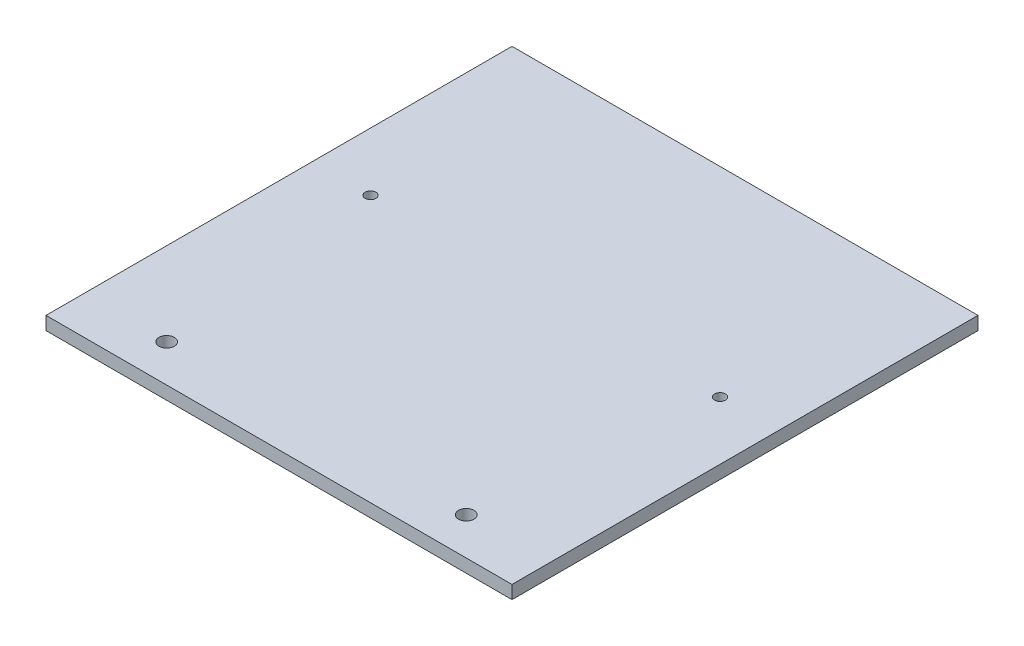
ISO-10303-21;
HEADER;
FILE_DESCRIPTION(('STEP AP214'),'2;1');
FILE_NAME('part.step','',(''),(''),'','','');
FILE_SCHEMA(('AUTOMOTIVE_DESIGN { 1 0 10303 214 1 1 1 1 }'));
ENDSEC;
DATA;
#1=APPLICATION_CONTEXT('core data for automotive mechanical design processes');
#2=APPLICATION_PROTOCOL_DEFINITION('international standard','automotive_design',2000,#1);
#3=PRODUCT_CONTEXT('',#1,'mechanical');
#4=PRODUCT('Part','Part','',(#3));
#5=PRODUCT_RELATED_PRODUCT_CATEGORY('part','',(#4));
#6=PRODUCT_DEFINITION_FORMATION('','',#4);
#7=PRODUCT_DEFINITION_CONTEXT('part definition',#1,'design');
#8=PRODUCT_DEFINITION('design','',#6,#7);
#9=PRODUCT_DEFINITION_SHAPE('','',#8);
#10=(LENGTH_UNIT() NAMED_UNIT(*) SI_UNIT(.MILLI.,.METRE.));
#11=(NAMED_UNIT(*) PLANE_ANGLE_UNIT() SI_UNIT($,.RADIAN.));
#12=(NAMED_UNIT(*) SI_UNIT($,.STERADIAN.) SOLID_ANGLE_UNIT());
#13=UNCERTAINTY_MEASURE_WITH_UNIT(LENGTH_MEASURE(1.E-05),#10,'distance_accuracy_value','');
#14=(GEOMETRIC_REPRESENTATION_CONTEXT(3) GLOBAL_UNCERTAINTY_ASSIGNED_CONTEXT((#13)) GLOBAL_UNIT_ASSIGNED_CONTEXT((#10,
#11,#12)) REPRESENTATION_CONTEXT('',''));
#15=CARTESIAN_POINT('',(0.,0.,0.));
#16=DIRECTION('',(0.,0.,1.));
#17=DIRECTION('',(1.,0.,0.));
#18=AXIS2_PLACEMENT_3D('',#15,#16,#17);
#19=CARTESIAN_POINT('',(0.,0.,0.));
#20=DIRECTION('',(0.,1.,0.));
#21=DIRECTION('',(0.,0.,1.));
#22=AXIS2_PLACEMENT_3D('',#19,#20,#21);
#23=PLANE('',#22);
#24=CARTESIAN_POINT('',(42.,0.,-7.99999999999999));
#25=DIRECTION('',(0.,1.,0.));
#26=DIRECTION('',(0.,0.,1.));
#27=AXIS2_PLACEMENT_3D('',#24,#25,#26);
#28=CIRCLE('',#27,1.3);
#29=CARTESIAN_POINT('',(42.,0.,-6.69999999999999));
#30=VERTEX_POINT('',#29);
#31=EDGE_CURVE('E133',#30,#30,#28,.F.);
#32=ORIENTED_EDGE('',*,*,#31,.F.);
#33=EDGE_LOOP('',(#32));
#34=FACE_BOUND('',#33,.T.);
#35=CARTESIAN_POINT('',(-42.,0.,-7.99999999999999));
#36=DIRECTION('',(0.,1.,0.));
#37=DIRECTION('',(0.,0.,1.));
#38=AXIS2_PLACEMENT_3D('',#35,#36,#37);
#39=CIRCLE('',#38,1.3);
#40=CARTESIAN_POINT('',(-42.,0.,-6.69999999999999));
#41=VERTEX_POINT('',#40);
#42=EDGE_CURVE('E127',#41,#41,#39,.F.);
#43=ORIENTED_EDGE('',*,*,#42,.F.);
#44=EDGE_LOOP('',(#43));
#45=FACE_BOUND('',#44,.T.);
#46=DIRECTION('',(0.,0.,1.));
#47=VECTOR('',#46,1.);
#48=CARTESIAN_POINT('',(-56.,0.,-56.));
#49=LINE('',#48,#47);
#50=CARTESIAN_POINT('',(-56.,0.,-56.));
#51=VERTEX_POINT('',#50);
#52=CARTESIAN_POINT('',(-56.,0.,56.));
#53=VERTEX_POINT('',#52);
#54=EDGE_CURVE('E104',#51,#53,#49,.T.);
#55=ORIENTED_EDGE('',*,*,#54,.F.);
#56=DIRECTION('',(-1.,0.,0.));
#57=VECTOR('',#56,1.);
#58=CARTESIAN_POINT('',(-56.,0.,-56.));
#59=LINE('',#58,#57);
#60=CARTESIAN_POINT('',(56.,0.,-56.));
#61=VERTEX_POINT('',#60);
#62=EDGE_CURVE('E80',#61,#51,#59,.T.);
#63=ORIENTED_EDGE('',*,*,#62,.F.);
#64=DIRECTION('',(0.,0.,-1.));
#65=VECTOR('',#64,1.);
#66=CARTESIAN_POINT('',(56.,0.,-56.));
#67=LINE('',#66,#65);
#68=CARTESIAN_POINT('',(56.,0.,56.));
#69=VERTEX_POINT('',#68);
#70=EDGE_CURVE('E74',#69,#61,#67,.T.);
#71=ORIENTED_EDGE('',*,*,#70,.F.);
#72=DIRECTION('',(1.,0.,0.));
#73=VECTOR('',#72,1.);
#74=CARTESIAN_POINT('',(-56.,0.,56.));
#75=LINE('',#74,#73);
#76=EDGE_CURVE('E96',#53,#69,#75,.T.);
#77=ORIENTED_EDGE('',*,*,#76,.F.);
#78=EDGE_LOOP('',(#55,#63,#71,#77));
#79=FACE_BOUND('',#78,.T.);
#80=CARTESIAN_POINT('',(36.,0.,47.));
#81=DIRECTION('',(0.,1.,0.));
#82=DIRECTION('',(0.,0.,1.));
#83=AXIS2_PLACEMENT_3D('',#80,#81,#82);
#84=CIRCLE('',#83,1.85);
#85=CARTESIAN_POINT('',(36.,0.,48.85));
#86=VERTEX_POINT('',#85);
#87=EDGE_CURVE('E107',#86,#86,#84,.F.);
#88=ORIENTED_EDGE('',*,*,#87,.F.);
#89=EDGE_LOOP('',(#88));
#90=FACE_BOUND('',#89,.T.);
#91=CARTESIAN_POINT('',(-36.,0.,47.));
#92=DIRECTION('',(0.,1.,0.));
#93=DIRECTION('',(0.,0.,1.));
#94=AXIS2_PLACEMENT_3D('',#91,#92,#93);
#95=CIRCLE('',#94,1.85);
#96=CARTESIAN_POINT('',(-36.,0.,48.85));
#97=VERTEX_POINT('',#96);
#98=EDGE_CURVE('E121',#97,#97,#95,.F.);
#99=ORIENTED_EDGE('',*,*,#98,.F.);
#100=EDGE_LOOP('',(#99));
#101=FACE_BOUND('',#100,.T.);
#102=ADVANCED_FACE('F40',(#34,#45,#79,#90,#101),#23,.F.);
#103=CARTESIAN_POINT('',(-56.,3.175,-56.));
#104=DIRECTION('',(1.,0.,0.));
#105=DIRECTION('',(0.,0.,-1.));
#106=AXIS2_PLACEMENT_3D('',#103,#104,#105);
#107=PLANE('',#106);
#108=ORIENTED_EDGE('',*,*,#54,.T.);
#109=DIRECTION('',(0.,-1.,0.));
#110=VECTOR('',#109,1.);
#111=CARTESIAN_POINT('',(-56.,3.175,56.));
#112=LINE('',#111,#110);
#113=CARTESIAN_POINT('',(-56.,3.175,56.));
#114=VERTEX_POINT('',#113);
#115=EDGE_CURVE('E11',#114,#53,#112,.T.);
#116=ORIENTED_EDGE('',*,*,#115,.F.);
#117=DIRECTION('',(0.,0.,1.));
#118=VECTOR('',#117,1.);
#119=CARTESIAN_POINT('',(-56.,3.175,-56.));
#120=LINE('',#119,#118);
#121=CARTESIAN_POINT('',(-56.,3.175,-56.));
#122=VERTEX_POINT('',#121);
#123=EDGE_CURVE('E92',#122,#114,#120,.T.);
#124=ORIENTED_EDGE('',*,*,#123,.F.);
#125=DIRECTION('',(0.,-1.,0.));
#126=VECTOR('',#125,1.);
#127=CARTESIAN_POINT('',(-56.,3.175,-56.));
#128=LINE('',#127,#126);
#129=EDGE_CURVE('E100',#122,#51,#128,.T.);
#130=ORIENTED_EDGE('',*,*,#129,.T.);
#131=EDGE_LOOP('',(#108,#116,#124,#130));
#132=FACE_BOUND('',#131,.T.);
#133=ADVANCED_FACE('F42',(#132),#107,.F.);
#134=CARTESIAN_POINT('',(-56.,3.175,56.));
#135=DIRECTION('',(0.,0.,-1.));
#136=DIRECTION('',(-1.,0.,0.));
#137=AXIS2_PLACEMENT_3D('',#134,#135,#136);
#138=PLANE('',#137);
#139=ORIENTED_EDGE('',*,*,#76,.T.);
#140=DIRECTION('',(0.,-1.,0.));
#141=VECTOR('',#140,1.);
#142=CARTESIAN_POINT('',(56.,3.175,56.));
#143=LINE('',#142,#141);
#144=CARTESIAN_POINT('',(56.,3.175,56.));
#145=VERTEX_POINT('',#144);
#146=EDGE_CURVE('E49',#145,#69,#143,.T.);
#147=ORIENTED_EDGE('',*,*,#146,.F.);
#148=DIRECTION('',(1.,0.,0.));
#149=VECTOR('',#148,1.);
#150=CARTESIAN_POINT('',(-56.,3.175,56.));
#151=LINE('',#150,#149);
#152=EDGE_CURVE('E87',#114,#145,#151,.T.);
#153=ORIENTED_EDGE('',*,*,#152,.F.);
#154=ORIENTED_EDGE('',*,*,#115,.T.);
#155=EDGE_LOOP('',(#139,#147,#153,#154));
#156=FACE_BOUND('',#155,.T.);
#157=ADVANCED_FACE('F95',(#156),#138,.F.);
#158=CARTESIAN_POINT('',(56.,3.175,-56.));
#159=DIRECTION('',(-1.,0.,0.));
#160=DIRECTION('',(0.,0.,1.));
#161=AXIS2_PLACEMENT_3D('',#158,#159,#160);
#162=PLANE('',#161);
#163=ORIENTED_EDGE('',*,*,#70,.T.);
#164=DIRECTION('',(0.,-1.,0.));
#165=VECTOR('',#164,1.);
#166=CARTESIAN_POINT('',(56.,3.175,-56.));
#167=LINE('',#166,#165);
#168=CARTESIAN_POINT('',(56.,3.175,-56.));
#169=VERTEX_POINT('',#168);
#170=EDGE_CURVE('E97',#169,#61,#167,.T.);
#171=ORIENTED_EDGE('',*,*,#170,.F.);
#172=DIRECTION('',(0.,0.,-1.));
#173=VECTOR('',#172,1.);
#174=CARTESIAN_POINT('',(56.,3.175,-56.));
#175=LINE('',#174,#173);
#176=EDGE_CURVE('E90',#145,#169,#175,.T.);
#177=ORIENTED_EDGE('',*,*,#176,.F.);
#178=ORIENTED_EDGE('',*,*,#146,.T.);
#179=EDGE_LOOP('',(#163,#171,#177,#178));
#180=FACE_BOUND('',#179,.T.);
#181=ADVANCED_FACE('F98',(#180),#162,.F.);
#182=CARTESIAN_POINT('',(-56.,3.175,-56.));
#183=DIRECTION('',(0.,0.,1.));
#184=DIRECTION('',(1.,0.,0.));
#185=AXIS2_PLACEMENT_3D('',#182,#183,#184);
#186=PLANE('',#185);
#187=ORIENTED_EDGE('',*,*,#62,.T.);
#188=ORIENTED_EDGE('',*,*,#129,.F.);
#189=DIRECTION('',(-1.,0.,0.));
#190=VECTOR('',#189,1.);
#191=CARTESIAN_POINT('',(-56.,3.175,-56.));
#192=LINE('',#191,#190);
#193=EDGE_CURVE('E57',#169,#122,#192,.T.);
#194=ORIENTED_EDGE('',*,*,#193,.F.);
#195=ORIENTED_EDGE('',*,*,#170,.T.);
#196=EDGE_LOOP('',(#187,#188,#194,#195));
#197=FACE_BOUND('',#196,.T.);
#198=ADVANCED_FACE('F112',(#197),#186,.F.);
#199=CARTESIAN_POINT('',(0.,3.175,0.));
#200=DIRECTION('',(0.,1.,0.));
#201=DIRECTION('',(0.,0.,1.));
#202=AXIS2_PLACEMENT_3D('',#199,#200,#201);
#203=PLANE('',#202);
#204=CARTESIAN_POINT('',(42.,3.175,-7.99999999999999));
#205=DIRECTION('',(0.,1.,0.));
#206=DIRECTION('',(0.,0.,1.));
#207=AXIS2_PLACEMENT_3D('',#204,#205,#206);
#208=CIRCLE('',#207,1.3);
#209=CARTESIAN_POINT('',(42.,3.175,-6.69999999999999));
#210=VERTEX_POINT('',#209);
#211=EDGE_CURVE('E136',#210,#210,#208,.T.);
#212=ORIENTED_EDGE('',*,*,#211,.F.);
#213=EDGE_LOOP('',(#212));
#214=FACE_BOUND('',#213,.T.);
#215=CARTESIAN_POINT('',(-42.,3.175,-7.99999999999999));
#216=DIRECTION('',(0.,1.,0.));
#217=DIRECTION('',(0.,0.,1.));
#218=AXIS2_PLACEMENT_3D('',#215,#216,#217);
#219=CIRCLE('',#218,1.3);
#220=CARTESIAN_POINT('',(-42.,3.175,-6.69999999999999));
#221=VERTEX_POINT('',#220);
#222=EDGE_CURVE('E130',#221,#221,#219,.T.);
#223=ORIENTED_EDGE('',*,*,#222,.F.);
#224=EDGE_LOOP('',(#223));
#225=FACE_BOUND('',#224,.T.);
#226=CARTESIAN_POINT('',(-36.,3.175,47.));
#227=DIRECTION('',(0.,1.,0.));
#228=DIRECTION('',(0.,0.,1.));
#229=AXIS2_PLACEMENT_3D('',#226,#227,#228);
#230=CIRCLE('',#229,1.85);
#231=CARTESIAN_POINT('',(-36.,3.175,48.85));
#232=VERTEX_POINT('',#231);
#233=EDGE_CURVE('E124',#232,#232,#230,.T.);
#234=ORIENTED_EDGE('',*,*,#233,.F.);
#235=EDGE_LOOP('',(#234));
#236=FACE_BOUND('',#235,.T.);
#237=CARTESIAN_POINT('',(36.,3.175,47.));
#238=DIRECTION('',(0.,1.,0.));
#239=DIRECTION('',(0.,0.,1.));
#240=AXIS2_PLACEMENT_3D('',#237,#238,#239);
#241=CIRCLE('',#240,1.85);
#242=CARTESIAN_POINT('',(36.,3.175,48.85));
#243=VERTEX_POINT('',#242);
#244=EDGE_CURVE('E118',#243,#243,#241,.T.);
#245=ORIENTED_EDGE('',*,*,#244,.F.);
#246=EDGE_LOOP('',(#245));
#247=FACE_BOUND('',#246,.T.);
#248=ORIENTED_EDGE('',*,*,#123,.T.);
#249=ORIENTED_EDGE('',*,*,#152,.T.);
#250=ORIENTED_EDGE('',*,*,#176,.T.);
#251=ORIENTED_EDGE('',*,*,#193,.T.);
#252=EDGE_LOOP('',(#248,#249,#250,#251));
#253=FACE_BOUND('',#252,.T.);
#254=ADVANCED_FACE('F88',(#214,#225,#236,#247,#253),#203,.T.);
#255=CARTESIAN_POINT('',(36.,3.175,47.));
#256=DIRECTION('',(0.,1.,0.));
#257=DIRECTION('',(0.,0.,1.));
#258=AXIS2_PLACEMENT_3D('',#255,#256,#257);
#259=CYLINDRICAL_SURFACE('',#258,1.85);
#260=ORIENTED_EDGE('',*,*,#87,.T.);
#261=EDGE_LOOP('',(#260));
#262=FACE_BOUND('',#261,.T.);
#263=ORIENTED_EDGE('',*,*,#244,.T.);
#264=EDGE_LOOP('',(#263));
#265=FACE_BOUND('',#264,.T.);
#266=ADVANCED_FACE('F159',(#262,#265),#259,.F.);
#267=CARTESIAN_POINT('',(-36.,3.175,47.));
#268=DIRECTION('',(0.,1.,0.));
#269=DIRECTION('',(0.,0.,1.));
#270=AXIS2_PLACEMENT_3D('',#267,#268,#269);
#271=CYLINDRICAL_SURFACE('',#270,1.85);
#272=ORIENTED_EDGE('',*,*,#98,.T.);
#273=EDGE_LOOP('',(#272));
#274=FACE_BOUND('',#273,.T.);
#275=ORIENTED_EDGE('',*,*,#233,.T.);
#276=EDGE_LOOP('',(#275));
#277=FACE_BOUND('',#276,.T.);
#278=ADVANCED_FACE('F153',(#274,#277),#271,.F.);
#279=CARTESIAN_POINT('',(-42.,3.175,-7.99999999999999));
#280=DIRECTION('',(0.,1.,0.));
#281=DIRECTION('',(0.,0.,1.));
#282=AXIS2_PLACEMENT_3D('',#279,#280,#281);
#283=CYLINDRICAL_SURFACE('',#282,1.3);
#284=ORIENTED_EDGE('',*,*,#42,.T.);
#285=EDGE_LOOP('',(#284));
#286=FACE_BOUND('',#285,.T.);
#287=ORIENTED_EDGE('',*,*,#222,.T.);
#288=EDGE_LOOP('',(#287));
#289=FACE_BOUND('',#288,.T.);
#290=ADVANCED_FACE('F150',(#286,#289),#283,.F.);
#291=CARTESIAN_POINT('',(42.,3.175,-7.99999999999999));
#292=DIRECTION('',(0.,1.,0.));
#293=DIRECTION('',(0.,0.,1.));
#294=AXIS2_PLACEMENT_3D('',#291,#292,#293);
#295=CYLINDRICAL_SURFACE('',#294,1.3);
#296=ORIENTED_EDGE('',*,*,#31,.T.);
#297=EDGE_LOOP('',(#296));
#298=FACE_BOUND('',#297,.T.);
#299=ORIENTED_EDGE('',*,*,#211,.T.);
#300=EDGE_LOOP('',(#299));
#301=FACE_BOUND('',#300,.T.);
#302=ADVANCED_FACE('F142',(#298,#301),#295,.F.);
#303=CLOSED_SHELL('',(#102,#133,#157,#181,#198,#254,#266,#278,#290,#302));
#304=MANIFOLD_SOLID_BREP('B2',#303);
#305=ADVANCED_BREP_SHAPE_REPRESENTATION('',(#18,#304),#14);
#306=SHAPE_DEFINITION_REPRESENTATION(#9,#305);
ENDSEC;
END-ISO-10303-21;
